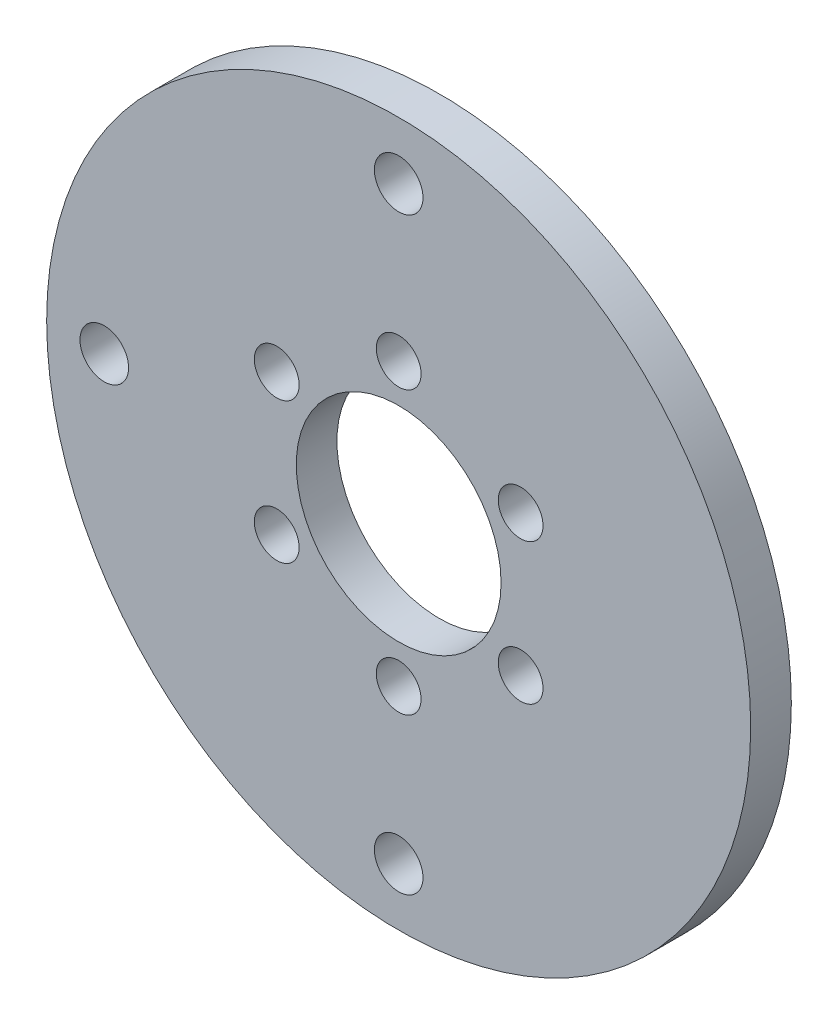
ISO-10303-21;
HEADER;
FILE_DESCRIPTION(('STEP AP214'),'2;1');
FILE_NAME('part.step','',(''),(''),'','','');
FILE_SCHEMA(('AUTOMOTIVE_DESIGN { 1 0 10303 214 1 1 1 1 }'));
ENDSEC;
DATA;
#1=APPLICATION_CONTEXT('core data for automotive mechanical design processes');
#2=APPLICATION_PROTOCOL_DEFINITION('international standard','automotive_design',2000,#1);
#3=PRODUCT_CONTEXT('',#1,'mechanical');
#4=PRODUCT('Part','Part','',(#3));
#5=PRODUCT_RELATED_PRODUCT_CATEGORY('part','',(#4));
#6=PRODUCT_DEFINITION_FORMATION('','',#4);
#7=PRODUCT_DEFINITION_CONTEXT('part definition',#1,'design');
#8=PRODUCT_DEFINITION('design','',#6,#7);
#9=PRODUCT_DEFINITION_SHAPE('','',#8);
#10=(LENGTH_UNIT() NAMED_UNIT(*) SI_UNIT(.MILLI.,.METRE.));
#11=(NAMED_UNIT(*) PLANE_ANGLE_UNIT() SI_UNIT($,.RADIAN.));
#12=(NAMED_UNIT(*) SI_UNIT($,.STERADIAN.) SOLID_ANGLE_UNIT());
#13=UNCERTAINTY_MEASURE_WITH_UNIT(LENGTH_MEASURE(1.E-05),#10,'distance_accuracy_value','');
#14=(GEOMETRIC_REPRESENTATION_CONTEXT(3) GLOBAL_UNCERTAINTY_ASSIGNED_CONTEXT((#13)) GLOBAL_UNIT_ASSIGNED_CONTEXT((#10,
#11,#12)) REPRESENTATION_CONTEXT('',''));
#15=CARTESIAN_POINT('',(0.,0.,0.));
#16=DIRECTION('',(0.,0.,1.));
#17=DIRECTION('',(1.,0.,0.));
#18=AXIS2_PLACEMENT_3D('',#15,#16,#17);
#19=CARTESIAN_POINT('',(0.,0.,3.175));
#20=DIRECTION('',(0.,0.,1.));
#21=DIRECTION('',(1.,0.,0.));
#22=AXIS2_PLACEMENT_3D('',#19,#20,#21);
#23=PLANE('',#22);
#24=CARTESIAN_POINT('',(-9.52627944162888,-5.49999999999991,3.175));
#25=DIRECTION('',(0.,0.,1.));
#26=DIRECTION('',(1.,0.,0.));
#27=AXIS2_PLACEMENT_3D('',#24,#25,#26);
#28=CIRCLE('',#27,1.75);
#29=CARTESIAN_POINT('',(-7.77627944162888,-5.49999999999991,3.175));
#30=VERTEX_POINT('',#29);
#31=EDGE_CURVE('E91',#30,#30,#28,.T.);
#32=ORIENTED_EDGE('',*,*,#31,.F.);
#33=EDGE_LOOP('',(#32));
#34=FACE_BOUND('',#33,.T.);
#35=CARTESIAN_POINT('',(9.5262794416288,-5.50000000000004,3.175));
#36=DIRECTION('',(0.,0.,1.));
#37=DIRECTION('',(1.,0.,0.));
#38=AXIS2_PLACEMENT_3D('',#35,#36,#37);
#39=CIRCLE('',#38,1.75);
#40=CARTESIAN_POINT('',(11.2762794416288,-5.50000000000004,3.175));
#41=VERTEX_POINT('',#40);
#42=EDGE_CURVE('E79',#41,#41,#39,.T.);
#43=ORIENTED_EDGE('',*,*,#42,.F.);
#44=EDGE_LOOP('',(#43));
#45=FACE_BOUND('',#44,.T.);
#46=CARTESIAN_POINT('',(-22.9999999999998,-3.99312779131623E-13,3.175));
#47=DIRECTION('',(0.,0.,1.));
#48=DIRECTION('',(1.,0.,0.));
#49=AXIS2_PLACEMENT_3D('',#46,#47,#48);
#50=CIRCLE('',#49,1.89865);
#51=CARTESIAN_POINT('',(-21.1013499999998,-3.99312779131623E-13,3.175));
#52=VERTEX_POINT('',#51);
#53=EDGE_CURVE('E67',#52,#52,#50,.T.);
#54=ORIENTED_EDGE('',*,*,#53,.F.);
#55=EDGE_LOOP('',(#54));
#56=FACE_BOUND('',#55,.T.);
#57=CARTESIAN_POINT('',(0.,11.,3.175));
#58=DIRECTION('',(0.,0.,1.));
#59=DIRECTION('',(1.,0.,0.));
#60=AXIS2_PLACEMENT_3D('',#57,#58,#59);
#61=CIRCLE('',#60,1.75);
#62=CARTESIAN_POINT('',(1.75,11.,3.175));
#63=VERTEX_POINT('',#62);
#64=EDGE_CURVE('E55',#63,#63,#61,.T.);
#65=ORIENTED_EDGE('',*,*,#64,.F.);
#66=EDGE_LOOP('',(#65));
#67=FACE_BOUND('',#66,.T.);
#68=CARTESIAN_POINT('',(0.,0.,3.175));
#69=DIRECTION('',(0.,0.,1.));
#70=DIRECTION('',(1.,0.,0.));
#71=AXIS2_PLACEMENT_3D('',#68,#69,#70);
#72=CIRCLE('',#71,8.);
#73=CARTESIAN_POINT('',(8.,0.,3.175));
#74=VERTEX_POINT('',#73);
#75=EDGE_CURVE('E44',#74,#74,#72,.T.);
#76=ORIENTED_EDGE('',*,*,#75,.F.);
#77=EDGE_LOOP('',(#76));
#78=FACE_BOUND('',#77,.T.);
#79=CARTESIAN_POINT('',(0.,0.,3.175));
#80=DIRECTION('',(0.,0.,1.));
#81=DIRECTION('',(1.,0.,0.));
#82=AXIS2_PLACEMENT_3D('',#79,#80,#81);
#83=CIRCLE('',#82,27.5);
#84=CARTESIAN_POINT('',(27.5,0.,3.175));
#85=VERTEX_POINT('',#84);
#86=EDGE_CURVE('E10',#85,#85,#83,.T.);
#87=ORIENTED_EDGE('',*,*,#86,.T.);
#88=EDGE_LOOP('',(#87));
#89=FACE_BOUND('',#88,.T.);
#90=CARTESIAN_POINT('',(0.,23.,3.175));
#91=DIRECTION('',(0.,0.,1.));
#92=DIRECTION('',(1.,0.,0.));
#93=AXIS2_PLACEMENT_3D('',#90,#91,#92);
#94=CIRCLE('',#93,1.89865);
#95=CARTESIAN_POINT('',(1.89865,23.,3.175));
#96=VERTEX_POINT('',#95);
#97=EDGE_CURVE('E49',#96,#96,#94,.T.);
#98=ORIENTED_EDGE('',*,*,#97,.F.);
#99=EDGE_LOOP('',(#98));
#100=FACE_BOUND('',#99,.T.);
#101=CARTESIAN_POINT('',(0.,-23.0000000000001,3.175));
#102=DIRECTION('',(0.,0.,1.));
#103=DIRECTION('',(1.,0.,0.));
#104=AXIS2_PLACEMENT_3D('',#101,#102,#103);
#105=CIRCLE('',#104,1.89865);
#106=CARTESIAN_POINT('',(1.89864999999992,-23.0000000000001,3.175));
#107=VERTEX_POINT('',#106);
#108=EDGE_CURVE('E61',#107,#107,#105,.T.);
#109=ORIENTED_EDGE('',*,*,#108,.F.);
#110=EDGE_LOOP('',(#109));
#111=FACE_BOUND('',#110,.T.);
#112=CARTESIAN_POINT('',(9.52627944162884,5.49999999999998,3.175));
#113=DIRECTION('',(0.,0.,1.));
#114=DIRECTION('',(1.,0.,0.));
#115=AXIS2_PLACEMENT_3D('',#112,#113,#114);
#116=CIRCLE('',#115,1.75);
#117=CARTESIAN_POINT('',(11.2762794416288,5.49999999999998,3.175));
#118=VERTEX_POINT('',#117);
#119=EDGE_CURVE('E73',#118,#118,#116,.T.);
#120=ORIENTED_EDGE('',*,*,#119,.F.);
#121=EDGE_LOOP('',(#120));
#122=FACE_BOUND('',#121,.T.);
#123=CARTESIAN_POINT('',(0.,-11.,3.175));
#124=DIRECTION('',(0.,0.,1.));
#125=DIRECTION('',(1.,0.,0.));
#126=AXIS2_PLACEMENT_3D('',#123,#124,#125);
#127=CIRCLE('',#126,1.75);
#128=CARTESIAN_POINT('',(1.74999999999992,-11.,3.175));
#129=VERTEX_POINT('',#128);
#130=EDGE_CURVE('E85',#129,#129,#127,.T.);
#131=ORIENTED_EDGE('',*,*,#130,.F.);
#132=EDGE_LOOP('',(#131));
#133=FACE_BOUND('',#132,.T.);
#134=CARTESIAN_POINT('',(-9.52627944162876,5.50000000000011,3.175));
#135=DIRECTION('',(0.,0.,1.));
#136=DIRECTION('',(1.,0.,0.));
#137=AXIS2_PLACEMENT_3D('',#134,#135,#136);
#138=CIRCLE('',#137,1.75);
#139=CARTESIAN_POINT('',(-7.77627944162876,5.50000000000011,3.175));
#140=VERTEX_POINT('',#139);
#141=EDGE_CURVE('E97',#140,#140,#138,.T.);
#142=ORIENTED_EDGE('',*,*,#141,.F.);
#143=EDGE_LOOP('',(#142));
#144=FACE_BOUND('',#143,.T.);
#145=ADVANCED_FACE('F33',(#34,#45,#56,#67,#78,#89,#100,#111,#122,#133,#144),#23,.T.);
#146=CARTESIAN_POINT('',(0.,0.,0.));
#147=DIRECTION('',(0.,0.,1.));
#148=DIRECTION('',(1.,0.,0.));
#149=AXIS2_PLACEMENT_3D('',#146,#147,#148);
#150=PLANE('',#149);
#151=CARTESIAN_POINT('',(0.,0.,0.));
#152=DIRECTION('',(0.,0.,1.));
#153=DIRECTION('',(1.,0.,0.));
#154=AXIS2_PLACEMENT_3D('',#151,#152,#153);
#155=CIRCLE('',#154,27.5);
#156=CARTESIAN_POINT('',(27.5,0.,0.));
#157=VERTEX_POINT('',#156);
#158=EDGE_CURVE('E37',#157,#157,#155,.T.);
#159=ORIENTED_EDGE('',*,*,#158,.F.);
#160=EDGE_LOOP('',(#159));
#161=FACE_BOUND('',#160,.T.);
#162=CARTESIAN_POINT('',(0.,0.,0.));
#163=DIRECTION('',(0.,0.,1.));
#164=DIRECTION('',(1.,0.,0.));
#165=AXIS2_PLACEMENT_3D('',#162,#163,#164);
#166=CIRCLE('',#165,8.);
#167=CARTESIAN_POINT('',(8.,0.,0.));
#168=VERTEX_POINT('',#167);
#169=EDGE_CURVE('E46',#168,#168,#166,.T.);
#170=ORIENTED_EDGE('',*,*,#169,.T.);
#171=EDGE_LOOP('',(#170));
#172=FACE_BOUND('',#171,.T.);
#173=CARTESIAN_POINT('',(0.,23.,0.));
#174=DIRECTION('',(0.,0.,1.));
#175=DIRECTION('',(1.,0.,0.));
#176=AXIS2_PLACEMENT_3D('',#173,#174,#175);
#177=CIRCLE('',#176,1.89865);
#178=CARTESIAN_POINT('',(1.89865,23.,0.));
#179=VERTEX_POINT('',#178);
#180=EDGE_CURVE('E52',#179,#179,#177,.T.);
#181=ORIENTED_EDGE('',*,*,#180,.T.);
#182=EDGE_LOOP('',(#181));
#183=FACE_BOUND('',#182,.T.);
#184=CARTESIAN_POINT('',(0.,11.,0.));
#185=DIRECTION('',(0.,0.,1.));
#186=DIRECTION('',(1.,0.,0.));
#187=AXIS2_PLACEMENT_3D('',#184,#185,#186);
#188=CIRCLE('',#187,1.75);
#189=CARTESIAN_POINT('',(1.75,11.,0.));
#190=VERTEX_POINT('',#189);
#191=EDGE_CURVE('E58',#190,#190,#188,.T.);
#192=ORIENTED_EDGE('',*,*,#191,.T.);
#193=EDGE_LOOP('',(#192));
#194=FACE_BOUND('',#193,.T.);
#195=CARTESIAN_POINT('',(0.,-23.0000000000001,0.));
#196=DIRECTION('',(0.,0.,1.));
#197=DIRECTION('',(1.,0.,0.));
#198=AXIS2_PLACEMENT_3D('',#195,#196,#197);
#199=CIRCLE('',#198,1.89865);
#200=CARTESIAN_POINT('',(1.89864999999992,-23.0000000000001,0.));
#201=VERTEX_POINT('',#200);
#202=EDGE_CURVE('E64',#201,#201,#199,.T.);
#203=ORIENTED_EDGE('',*,*,#202,.T.);
#204=EDGE_LOOP('',(#203));
#205=FACE_BOUND('',#204,.T.);
#206=CARTESIAN_POINT('',(-22.9999999999998,-3.99312779131623E-13,0.));
#207=DIRECTION('',(0.,0.,1.));
#208=DIRECTION('',(1.,0.,0.));
#209=AXIS2_PLACEMENT_3D('',#206,#207,#208);
#210=CIRCLE('',#209,1.89865);
#211=CARTESIAN_POINT('',(-21.1013499999998,-3.99312779131623E-13,0.));
#212=VERTEX_POINT('',#211);
#213=EDGE_CURVE('E70',#212,#212,#210,.T.);
#214=ORIENTED_EDGE('',*,*,#213,.T.);
#215=EDGE_LOOP('',(#214));
#216=FACE_BOUND('',#215,.T.);
#217=CARTESIAN_POINT('',(9.52627944162884,5.49999999999998,0.));
#218=DIRECTION('',(0.,0.,1.));
#219=DIRECTION('',(1.,0.,0.));
#220=AXIS2_PLACEMENT_3D('',#217,#218,#219);
#221=CIRCLE('',#220,1.75);
#222=CARTESIAN_POINT('',(11.2762794416288,5.49999999999998,0.));
#223=VERTEX_POINT('',#222);
#224=EDGE_CURVE('E76',#223,#223,#221,.T.);
#225=ORIENTED_EDGE('',*,*,#224,.T.);
#226=EDGE_LOOP('',(#225));
#227=FACE_BOUND('',#226,.T.);
#228=CARTESIAN_POINT('',(9.5262794416288,-5.50000000000004,0.));
#229=DIRECTION('',(0.,0.,1.));
#230=DIRECTION('',(1.,0.,0.));
#231=AXIS2_PLACEMENT_3D('',#228,#229,#230);
#232=CIRCLE('',#231,1.75);
#233=CARTESIAN_POINT('',(11.2762794416288,-5.50000000000004,0.));
#234=VERTEX_POINT('',#233);
#235=EDGE_CURVE('E82',#234,#234,#232,.T.);
#236=ORIENTED_EDGE('',*,*,#235,.T.);
#237=EDGE_LOOP('',(#236));
#238=FACE_BOUND('',#237,.T.);
#239=CARTESIAN_POINT('',(0.,-11.,0.));
#240=DIRECTION('',(0.,0.,1.));
#241=DIRECTION('',(1.,0.,0.));
#242=AXIS2_PLACEMENT_3D('',#239,#240,#241);
#243=CIRCLE('',#242,1.75);
#244=CARTESIAN_POINT('',(1.74999999999992,-11.,0.));
#245=VERTEX_POINT('',#244);
#246=EDGE_CURVE('E88',#245,#245,#243,.T.);
#247=ORIENTED_EDGE('',*,*,#246,.T.);
#248=EDGE_LOOP('',(#247));
#249=FACE_BOUND('',#248,.T.);
#250=CARTESIAN_POINT('',(-9.52627944162888,-5.49999999999991,0.));
#251=DIRECTION('',(0.,0.,1.));
#252=DIRECTION('',(1.,0.,0.));
#253=AXIS2_PLACEMENT_3D('',#250,#251,#252);
#254=CIRCLE('',#253,1.75);
#255=CARTESIAN_POINT('',(-7.77627944162888,-5.49999999999991,0.));
#256=VERTEX_POINT('',#255);
#257=EDGE_CURVE('E94',#256,#256,#254,.T.);
#258=ORIENTED_EDGE('',*,*,#257,.T.);
#259=EDGE_LOOP('',(#258));
#260=FACE_BOUND('',#259,.T.);
#261=CARTESIAN_POINT('',(-9.52627944162876,5.50000000000011,0.));
#262=DIRECTION('',(0.,0.,1.));
#263=DIRECTION('',(1.,0.,0.));
#264=AXIS2_PLACEMENT_3D('',#261,#262,#263);
#265=CIRCLE('',#264,1.75);
#266=CARTESIAN_POINT('',(-7.77627944162876,5.50000000000011,0.));
#267=VERTEX_POINT('',#266);
#268=EDGE_CURVE('E100',#267,#267,#265,.T.);
#269=ORIENTED_EDGE('',*,*,#268,.T.);
#270=EDGE_LOOP('',(#269));
#271=FACE_BOUND('',#270,.T.);
#272=ADVANCED_FACE('F110',(#161,#172,#183,#194,#205,#216,#227,#238,#249,#260,#271),#150,.F.);
#273=CARTESIAN_POINT('',(0.,0.,3.175));
#274=DIRECTION('',(0.,0.,-1.));
#275=DIRECTION('',(-1.,0.,0.));
#276=AXIS2_PLACEMENT_3D('',#273,#274,#275);
#277=CYLINDRICAL_SURFACE('',#276,27.5);
#278=ORIENTED_EDGE('',*,*,#86,.F.);
#279=EDGE_LOOP('',(#278));
#280=FACE_BOUND('',#279,.T.);
#281=ORIENTED_EDGE('',*,*,#158,.T.);
#282=EDGE_LOOP('',(#281));
#283=FACE_BOUND('',#282,.T.);
#284=ADVANCED_FACE('F35',(#280,#283),#277,.T.);
#285=CARTESIAN_POINT('',(0.,0.,3.175));
#286=DIRECTION('',(0.,0.,-1.));
#287=DIRECTION('',(-1.,0.,0.));
#288=AXIS2_PLACEMENT_3D('',#285,#286,#287);
#289=CYLINDRICAL_SURFACE('',#288,8.);
#290=ORIENTED_EDGE('',*,*,#75,.T.);
#291=EDGE_LOOP('',(#290));
#292=FACE_BOUND('',#291,.T.);
#293=ORIENTED_EDGE('',*,*,#169,.F.);
#294=EDGE_LOOP('',(#293));
#295=FACE_BOUND('',#294,.T.);
#296=ADVANCED_FACE('F120',(#292,#295),#289,.F.);
#297=CARTESIAN_POINT('',(0.,23.,3.175));
#298=DIRECTION('',(0.,0.,-1.));
#299=DIRECTION('',(-1.,0.,0.));
#300=AXIS2_PLACEMENT_3D('',#297,#298,#299);
#301=CYLINDRICAL_SURFACE('',#300,1.89865);
#302=ORIENTED_EDGE('',*,*,#97,.T.);
#303=EDGE_LOOP('',(#302));
#304=FACE_BOUND('',#303,.T.);
#305=ORIENTED_EDGE('',*,*,#180,.F.);
#306=EDGE_LOOP('',(#305));
#307=FACE_BOUND('',#306,.T.);
#308=ADVANCED_FACE('F123',(#304,#307),#301,.F.);
#309=CARTESIAN_POINT('',(0.,11.,3.175));
#310=DIRECTION('',(0.,0.,-1.));
#311=DIRECTION('',(-1.,0.,0.));
#312=AXIS2_PLACEMENT_3D('',#309,#310,#311);
#313=CYLINDRICAL_SURFACE('',#312,1.75);
#314=ORIENTED_EDGE('',*,*,#64,.T.);
#315=EDGE_LOOP('',(#314));
#316=FACE_BOUND('',#315,.T.);
#317=ORIENTED_EDGE('',*,*,#191,.F.);
#318=EDGE_LOOP('',(#317));
#319=FACE_BOUND('',#318,.T.);
#320=ADVANCED_FACE('F127',(#316,#319),#313,.F.);
#321=CARTESIAN_POINT('',(0.,-23.0000000000001,3.175));
#322=DIRECTION('',(0.,0.,-1.));
#323=DIRECTION('',(-1.,0.,0.));
#324=AXIS2_PLACEMENT_3D('',#321,#322,#323);
#325=CYLINDRICAL_SURFACE('',#324,1.89865);
#326=ORIENTED_EDGE('',*,*,#108,.T.);
#327=EDGE_LOOP('',(#326));
#328=FACE_BOUND('',#327,.T.);
#329=ORIENTED_EDGE('',*,*,#202,.F.);
#330=EDGE_LOOP('',(#329));
#331=FACE_BOUND('',#330,.T.);
#332=ADVANCED_FACE('F131',(#328,#331),#325,.F.);
#333=CARTESIAN_POINT('',(-22.9999999999998,-3.99312779131623E-13,3.175));
#334=DIRECTION('',(0.,0.,-1.));
#335=DIRECTION('',(-1.,0.,0.));
#336=AXIS2_PLACEMENT_3D('',#333,#334,#335);
#337=CYLINDRICAL_SURFACE('',#336,1.89865);
#338=ORIENTED_EDGE('',*,*,#53,.T.);
#339=EDGE_LOOP('',(#338));
#340=FACE_BOUND('',#339,.T.);
#341=ORIENTED_EDGE('',*,*,#213,.F.);
#342=EDGE_LOOP('',(#341));
#343=FACE_BOUND('',#342,.T.);
#344=ADVANCED_FACE('F135',(#340,#343),#337,.F.);
#345=CARTESIAN_POINT('',(9.52627944162884,5.49999999999998,3.175));
#346=DIRECTION('',(0.,0.,-1.));
#347=DIRECTION('',(-1.,0.,0.));
#348=AXIS2_PLACEMENT_3D('',#345,#346,#347);
#349=CYLINDRICAL_SURFACE('',#348,1.75);
#350=ORIENTED_EDGE('',*,*,#119,.T.);
#351=EDGE_LOOP('',(#350));
#352=FACE_BOUND('',#351,.T.);
#353=ORIENTED_EDGE('',*,*,#224,.F.);
#354=EDGE_LOOP('',(#353));
#355=FACE_BOUND('',#354,.T.);
#356=ADVANCED_FACE('F139',(#352,#355),#349,.F.);
#357=CARTESIAN_POINT('',(9.5262794416288,-5.50000000000004,3.175));
#358=DIRECTION('',(0.,0.,-1.));
#359=DIRECTION('',(-1.,0.,0.));
#360=AXIS2_PLACEMENT_3D('',#357,#358,#359);
#361=CYLINDRICAL_SURFACE('',#360,1.75);
#362=ORIENTED_EDGE('',*,*,#42,.T.);
#363=EDGE_LOOP('',(#362));
#364=FACE_BOUND('',#363,.T.);
#365=ORIENTED_EDGE('',*,*,#235,.F.);
#366=EDGE_LOOP('',(#365));
#367=FACE_BOUND('',#366,.T.);
#368=ADVANCED_FACE('F143',(#364,#367),#361,.F.);
#369=CARTESIAN_POINT('',(0.,-11.,3.175));
#370=DIRECTION('',(0.,0.,-1.));
#371=DIRECTION('',(-1.,0.,0.));
#372=AXIS2_PLACEMENT_3D('',#369,#370,#371);
#373=CYLINDRICAL_SURFACE('',#372,1.75);
#374=ORIENTED_EDGE('',*,*,#130,.T.);
#375=EDGE_LOOP('',(#374));
#376=FACE_BOUND('',#375,.T.);
#377=ORIENTED_EDGE('',*,*,#246,.F.);
#378=EDGE_LOOP('',(#377));
#379=FACE_BOUND('',#378,.T.);
#380=ADVANCED_FACE('F147',(#376,#379),#373,.F.);
#381=CARTESIAN_POINT('',(-9.52627944162888,-5.49999999999991,3.175));
#382=DIRECTION('',(0.,0.,-1.));
#383=DIRECTION('',(-1.,0.,0.));
#384=AXIS2_PLACEMENT_3D('',#381,#382,#383);
#385=CYLINDRICAL_SURFACE('',#384,1.75);
#386=ORIENTED_EDGE('',*,*,#31,.T.);
#387=EDGE_LOOP('',(#386));
#388=FACE_BOUND('',#387,.T.);
#389=ORIENTED_EDGE('',*,*,#257,.F.);
#390=EDGE_LOOP('',(#389));
#391=FACE_BOUND('',#390,.T.);
#392=ADVANCED_FACE('F151',(#388,#391),#385,.F.);
#393=CARTESIAN_POINT('',(-9.52627944162876,5.50000000000011,3.175));
#394=DIRECTION('',(0.,0.,-1.));
#395=DIRECTION('',(-1.,0.,0.));
#396=AXIS2_PLACEMENT_3D('',#393,#394,#395);
#397=CYLINDRICAL_SURFACE('',#396,1.75);
#398=ORIENTED_EDGE('',*,*,#141,.T.);
#399=EDGE_LOOP('',(#398));
#400=FACE_BOUND('',#399,.T.);
#401=ORIENTED_EDGE('',*,*,#268,.F.);
#402=EDGE_LOOP('',(#401));
#403=FACE_BOUND('',#402,.T.);
#404=ADVANCED_FACE('F106',(#400,#403),#397,.F.);
#405=CLOSED_SHELL('',(#145,#272,#284,#296,#308,#320,#332,#344,#356,#368,#380,#392,#404));
#406=MANIFOLD_SOLID_BREP('B2',#405);
#407=ADVANCED_BREP_SHAPE_REPRESENTATION('',(#18,#406),#14);
#408=SHAPE_DEFINITION_REPRESENTATION(#9,#407);
ENDSEC;
END-ISO-10303-21;
